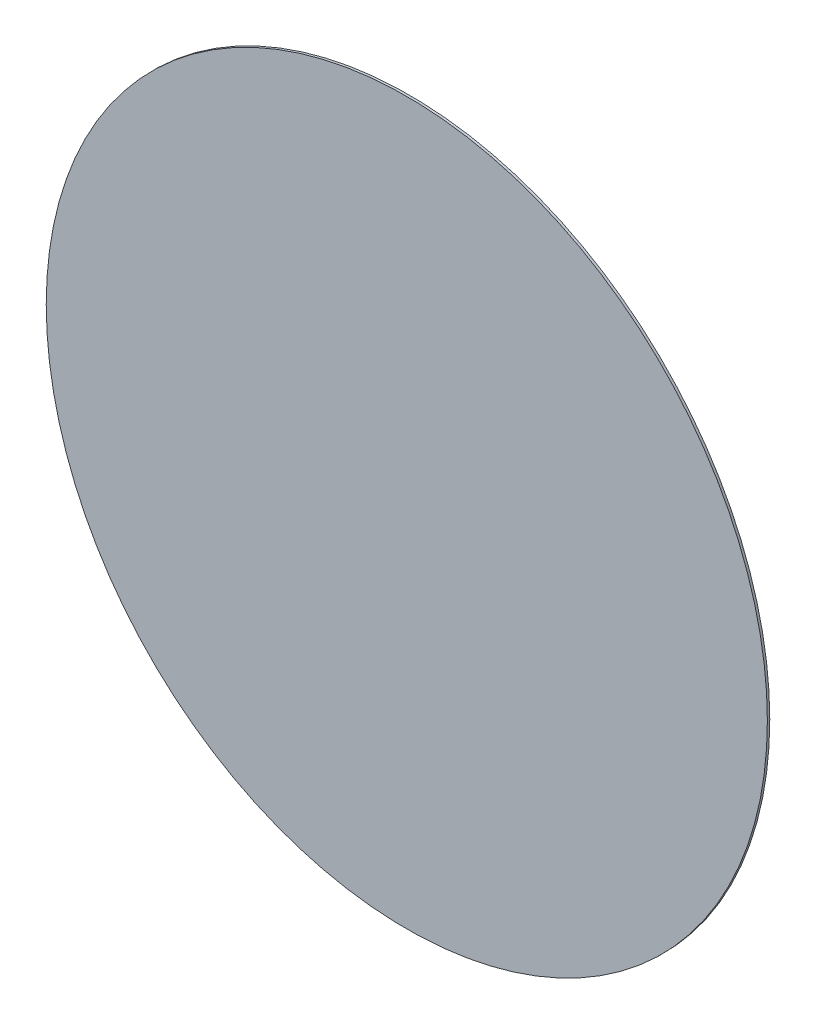
ISO-10303-21;
HEADER;
FILE_DESCRIPTION(('STEP AP214'),'2;1');
FILE_NAME('part.step','',(''),(''),'','','');
FILE_SCHEMA(('AUTOMOTIVE_DESIGN { 1 0 10303 214 1 1 1 1 }'));
ENDSEC;
DATA;
#1=APPLICATION_CONTEXT('core data for automotive mechanical design processes');
#2=APPLICATION_PROTOCOL_DEFINITION('international standard','automotive_design',2000,#1);
#3=PRODUCT_CONTEXT('',#1,'mechanical');
#4=PRODUCT('Part','Part','',(#3));
#5=PRODUCT_RELATED_PRODUCT_CATEGORY('part','',(#4));
#6=PRODUCT_DEFINITION_FORMATION('','',#4);
#7=PRODUCT_DEFINITION_CONTEXT('part definition',#1,'design');
#8=PRODUCT_DEFINITION('design','',#6,#7);
#9=PRODUCT_DEFINITION_SHAPE('','',#8);
#10=(LENGTH_UNIT() NAMED_UNIT(*) SI_UNIT(.MILLI.,.METRE.));
#11=(NAMED_UNIT(*) PLANE_ANGLE_UNIT() SI_UNIT($,.RADIAN.));
#12=(NAMED_UNIT(*) SI_UNIT($,.STERADIAN.) SOLID_ANGLE_UNIT());
#13=UNCERTAINTY_MEASURE_WITH_UNIT(LENGTH_MEASURE(1.E-05),#10,'distance_accuracy_value','');
#14=(GEOMETRIC_REPRESENTATION_CONTEXT(3) GLOBAL_UNCERTAINTY_ASSIGNED_CONTEXT((#13)) GLOBAL_UNIT_ASSIGNED_CONTEXT((#10,
#11,#12)) REPRESENTATION_CONTEXT('',''));
#15=CARTESIAN_POINT('',(0.,0.,0.));
#16=DIRECTION('',(0.,0.,1.));
#17=DIRECTION('',(1.,0.,0.));
#18=AXIS2_PLACEMENT_3D('',#15,#16,#17);
#19=CARTESIAN_POINT('',(0.,0.,0.));
#20=DIRECTION('',(0.,0.,1.));
#21=DIRECTION('',(1.,0.,0.));
#22=AXIS2_PLACEMENT_3D('',#19,#20,#21);
#23=PLANE('',#22);
#24=CARTESIAN_POINT('',(14.7298686293487,12.3807085462198,0.));
#25=DIRECTION('',(0.,0.,-1.));
#26=DIRECTION('',(-1.,0.,0.));
#27=AXIS2_PLACEMENT_3D('',#24,#25,#26);
#28=CIRCLE('',#27,0.500000000000001);
#29=CARTESIAN_POINT('',(14.2298686293487,12.3807085462198,0.));
#30=VERTEX_POINT('',#29);
#31=EDGE_CURVE('E11',#30,#30,#28,.T.);
#32=ORIENTED_EDGE('',*,*,#31,.F.);
#33=EDGE_LOOP('',(#32));
#34=FACE_BOUND('',#33,.T.);
#35=CARTESIAN_POINT('',(0.,0.,0.));
#36=DIRECTION('',(0.,0.,1.));
#37=DIRECTION('',(1.,0.,0.));
#38=AXIS2_PLACEMENT_3D('',#35,#36,#37);
#39=CIRCLE('',#38,30.);
#40=CARTESIAN_POINT('',(30.,0.,0.));
#41=VERTEX_POINT('',#40);
#42=EDGE_CURVE('E36',#41,#41,#39,.T.);
#43=ORIENTED_EDGE('',*,*,#42,.F.);
#44=EDGE_LOOP('',(#43));
#45=FACE_BOUND('',#44,.T.);
#46=CARTESIAN_POINT('',(14.7298686293487,2.38070854621981,0.));
#47=DIRECTION('',(0.,0.,1.));
#48=DIRECTION('',(-1.,0.,0.));
#49=AXIS2_PLACEMENT_3D('',#46,#47,#48);
#50=CIRCLE('',#49,0.500000000000001);
#51=CARTESIAN_POINT('',(14.2298686293487,2.38070854621981,0.));
#52=VERTEX_POINT('',#51);
#53=EDGE_CURVE('E60',#52,#52,#50,.T.);
#54=ORIENTED_EDGE('',*,*,#53,.T.);
#55=EDGE_LOOP('',(#54));
#56=FACE_BOUND('',#55,.T.);
#57=ADVANCED_FACE('F32',(#34,#45,#56),#23,.F.);
#58=CARTESIAN_POINT('',(0.,0.,0.2));
#59=DIRECTION('',(0.,0.,-1.));
#60=DIRECTION('',(-1.,0.,0.));
#61=AXIS2_PLACEMENT_3D('',#58,#59,#60);
#62=CYLINDRICAL_SURFACE('',#61,30.);
#63=CARTESIAN_POINT('',(0.,0.,0.2));
#64=DIRECTION('',(0.,0.,1.));
#65=DIRECTION('',(1.,0.,0.));
#66=AXIS2_PLACEMENT_3D('',#63,#64,#65);
#67=CIRCLE('',#66,30.);
#68=CARTESIAN_POINT('',(30.,0.,0.2));
#69=VERTEX_POINT('',#68);
#70=EDGE_CURVE('E41',#69,#69,#67,.T.);
#71=ORIENTED_EDGE('',*,*,#70,.F.);
#72=EDGE_LOOP('',(#71));
#73=FACE_BOUND('',#72,.T.);
#74=ORIENTED_EDGE('',*,*,#42,.T.);
#75=EDGE_LOOP('',(#74));
#76=FACE_BOUND('',#75,.T.);
#77=ADVANCED_FACE('F34',(#73,#76),#62,.T.);
#78=CARTESIAN_POINT('',(0.,0.,0.2));
#79=DIRECTION('',(0.,0.,1.));
#80=DIRECTION('',(1.,0.,0.));
#81=AXIS2_PLACEMENT_3D('',#78,#79,#80);
#82=PLANE('',#81);
#83=ORIENTED_EDGE('',*,*,#70,.T.);
#84=EDGE_LOOP('',(#83));
#85=FACE_BOUND('',#84,.T.);
#86=ADVANCED_FACE('F84',(#85),#82,.T.);
#87=CARTESIAN_POINT('',(14.7298686293487,12.3807085462198,0.));
#88=DIRECTION('',(0.,0.,-1.));
#89=DIRECTION('',(-1.,0.,0.));
#90=AXIS2_PLACEMENT_3D('',#87,#88,#89);
#91=CYLINDRICAL_SURFACE('',#90,0.500000000000001);
#92=CARTESIAN_POINT('',(14.7298686293487,12.3807085462198,-3.5));
#93=DIRECTION('',(0.,0.,-1.));
#94=DIRECTION('',(-1.,0.,0.));
#95=AXIS2_PLACEMENT_3D('',#92,#93,#94);
#96=CIRCLE('',#95,0.500000000000001);
#97=CARTESIAN_POINT('',(14.7298686293487,11.8807085462198,-3.5));
#98=VERTEX_POINT('',#97);
#99=EDGE_CURVE('E47',#98,#98,#96,.T.);
#100=ORIENTED_EDGE('',*,*,#99,.F.);
#101=EDGE_LOOP('',(#100));
#102=FACE_BOUND('',#101,.T.);
#103=ORIENTED_EDGE('',*,*,#31,.T.);
#104=EDGE_LOOP('',(#103));
#105=FACE_BOUND('',#104,.T.);
#106=ADVANCED_FACE('F95',(#102,#105),#91,.T.);
#107=CARTESIAN_POINT('',(14.7298686293487,11.8807085462198,-3.));
#108=DIRECTION('',(0.,-1.,0.));
#109=DIRECTION('',(0.,0.,1.));
#110=AXIS2_PLACEMENT_3D('',#107,#108,#109);
#111=CIRCLE('',#110,0.500000000000001);
#112=TRIMMED_CURVE('',#111,(PARAMETER_VALUE(-3.14159261144294)),
(PARAMETER_VALUE(3.14159261144294)),.T.,.PARAMETER.);
#113=CARTESIAN_POINT('',(14.7298686293487,11.8807085462198,-3.5));
#114=DIRECTION('',(-1.,0.,0.));
#115=AXIS1_PLACEMENT('',#113,#114);
#116=SURFACE_OF_REVOLUTION('',#112,#115);
#117=CARTESIAN_POINT('',(14.7298686293487,11.8807085462198,-4.));
#118=DIRECTION('',(0.,-1.,0.));
#119=DIRECTION('',(-1.,0.,0.));
#120=AXIS2_PLACEMENT_3D('',#117,#118,#119);
#121=CIRCLE('',#120,0.500000000000001);
#122=EDGE_CURVE('E58',#98,#98,#121,.T.);
#123=ORIENTED_EDGE('',*,*,#122,.F.);
#124=ORIENTED_EDGE('',*,*,#99,.T.);
#125=EDGE_LOOP('',(#123,#124));
#126=FACE_BOUND('',#125,.T.);
#127=ADVANCED_FACE('F90',(#126),#116,.T.);
#128=CARTESIAN_POINT('',(14.7298686293487,11.8807085462198,-4.));
#129=DIRECTION('',(0.,-1.,0.));
#130=DIRECTION('',(0.,0.,-1.));
#131=AXIS2_PLACEMENT_3D('',#128,#129,#130);
#132=CYLINDRICAL_SURFACE('',#131,0.500000000000001);
#133=CARTESIAN_POINT('',(14.7298686293487,2.88070854621981,-4.));
#134=DIRECTION('',(0.,-1.,0.));
#135=DIRECTION('',(-1.,0.,0.));
#136=AXIS2_PLACEMENT_3D('',#133,#134,#135);
#137=CIRCLE('',#136,0.500000000000001);
#138=CARTESIAN_POINT('',(14.7298686293487,2.88070854621981,-3.5));
#139=VERTEX_POINT('',#138);
#140=EDGE_CURVE('E51',#139,#139,#137,.T.);
#141=ORIENTED_EDGE('',*,*,#140,.F.);
#142=EDGE_LOOP('',(#141));
#143=FACE_BOUND('',#142,.T.);
#144=ORIENTED_EDGE('',*,*,#122,.T.);
#145=EDGE_LOOP('',(#144));
#146=FACE_BOUND('',#145,.T.);
#147=ADVANCED_FACE('F52',(#143,#146),#132,.T.);
#148=CARTESIAN_POINT('',(14.7298686293487,2.88070854621981,-3.5));
#149=DIRECTION('',(-1.,0.,0.));
#150=DIRECTION('',(0.,0.,1.));
#151=AXIS2_PLACEMENT_3D('',#148,#149,#150);
#152=DEGENERATE_TOROIDAL_SURFACE('',#151,0.500000000000001,0.500000000000001,.T.);
#153=CARTESIAN_POINT('',(14.7298686293487,2.38070854621981,-3.5));
#154=DIRECTION('',(0.,0.,1.));
#155=DIRECTION('',(-1.,0.,0.));
#156=AXIS2_PLACEMENT_3D('',#153,#154,#155);
#157=CIRCLE('',#156,0.500000000000001);
#158=EDGE_CURVE('E57',#139,#139,#157,.T.);
#159=ORIENTED_EDGE('',*,*,#158,.F.);
#160=ORIENTED_EDGE('',*,*,#140,.T.);
#161=EDGE_LOOP('',(#159,#160));
#162=FACE_BOUND('',#161,.T.);
#163=ADVANCED_FACE('F82',(#162),#152,.T.);
#164=CARTESIAN_POINT('',(14.7298686293487,2.38070854621981,-3.5));
#165=DIRECTION('',(0.,0.,1.));
#166=DIRECTION('',(1.,0.,0.));
#167=AXIS2_PLACEMENT_3D('',#164,#165,#166);
#168=CYLINDRICAL_SURFACE('',#167,0.500000000000001);
#169=ORIENTED_EDGE('',*,*,#53,.F.);
#170=EDGE_LOOP('',(#169));
#171=FACE_BOUND('',#170,.T.);
#172=ORIENTED_EDGE('',*,*,#158,.T.);
#173=EDGE_LOOP('',(#172));
#174=FACE_BOUND('',#173,.T.);
#175=ADVANCED_FACE('F79',(#171,#174),#168,.T.);
#176=CLOSED_SHELL('',(#57,#77,#86,#106,#127,#147,#163,#175));
#177=MANIFOLD_SOLID_BREP('B2',#176);
#178=ADVANCED_BREP_SHAPE_REPRESENTATION('',(#18,#177),#14);
#179=SHAPE_DEFINITION_REPRESENTATION(#9,#178);
ENDSEC;
END-ISO-10303-21;
